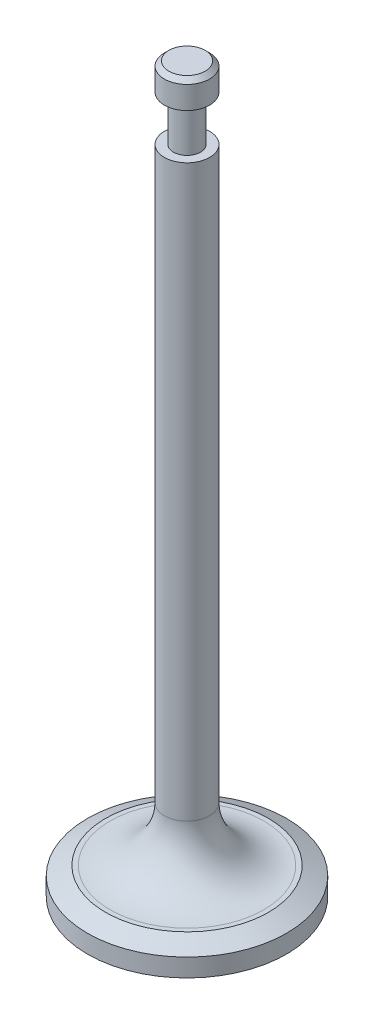
ISO-10303-21;
HEADER;
FILE_DESCRIPTION(('STEP AP214'),'2;1');
FILE_NAME('part.step','',(''),(''),'','','');
FILE_SCHEMA(('AUTOMOTIVE_DESIGN { 1 0 10303 214 1 1 1 1 }'));
ENDSEC;
DATA;
#1=APPLICATION_CONTEXT('core data for automotive mechanical design processes');
#2=APPLICATION_PROTOCOL_DEFINITION('international standard','automotive_design',2000,#1);
#3=PRODUCT_CONTEXT('',#1,'mechanical');
#4=PRODUCT('Part','Part','',(#3));
#5=PRODUCT_RELATED_PRODUCT_CATEGORY('part','',(#4));
#6=PRODUCT_DEFINITION_FORMATION('','',#4);
#7=PRODUCT_DEFINITION_CONTEXT('part definition',#1,'design');
#8=PRODUCT_DEFINITION('design','',#6,#7);
#9=PRODUCT_DEFINITION_SHAPE('','',#8);
#10=(LENGTH_UNIT() NAMED_UNIT(*) SI_UNIT(.MILLI.,.METRE.));
#11=(NAMED_UNIT(*) PLANE_ANGLE_UNIT() SI_UNIT($,.RADIAN.));
#12=(NAMED_UNIT(*) SI_UNIT($,.STERADIAN.) SOLID_ANGLE_UNIT());
#13=UNCERTAINTY_MEASURE_WITH_UNIT(LENGTH_MEASURE(1.E-05),#10,'distance_accuracy_value','');
#14=(GEOMETRIC_REPRESENTATION_CONTEXT(3) GLOBAL_UNCERTAINTY_ASSIGNED_CONTEXT((#13)) GLOBAL_UNIT_ASSIGNED_CONTEXT((#10,
#11,#12)) REPRESENTATION_CONTEXT('',''));
#15=CARTESIAN_POINT('',(0.,0.,0.));
#16=DIRECTION('',(0.,0.,1.));
#17=DIRECTION('',(1.,0.,0.));
#18=AXIS2_PLACEMENT_3D('',#15,#16,#17);
#19=CARTESIAN_POINT('',(0.,0.,-10.));
#20=DIRECTION('',(0.,-1.,0.));
#21=DIRECTION('',(0.,0.,-1.));
#22=AXIS2_PLACEMENT_3D('',#19,#20,#21);
#23=PLANE('',#22);
#24=CARTESIAN_POINT('',(0.,0.,0.));
#25=DIRECTION('',(0.,-1.,0.));
#26=DIRECTION('',(0.,0.,-1.));
#27=AXIS2_PLACEMENT_3D('',#24,#25,#26);
#28=CIRCLE('',#27,8.00000000000003);
#29=CARTESIAN_POINT('',(0.,0.,-8.00000000000003));
#30=VERTEX_POINT('',#29);
#31=EDGE_CURVE('E45',#30,#30,#28,.F.);
#32=ORIENTED_EDGE('',*,*,#31,.T.);
#33=EDGE_LOOP('',(#32));
#34=FACE_BOUND('',#33,.T.);
#35=ADVANCED_FACE('F37',(#34),#23,.F.);
#36=CARTESIAN_POINT('',(0.,-320.,0.));
#37=DIRECTION('',(0.,1.,0.));
#38=DIRECTION('',(0.,0.,1.));
#39=AXIS2_PLACEMENT_3D('',#36,#37,#38);
#40=PLANE('',#39);
#41=CARTESIAN_POINT('',(0.,-320.,0.));
#42=DIRECTION('',(0.,1.,0.));
#43=DIRECTION('',(0.,0.,1.));
#44=AXIS2_PLACEMENT_3D('',#41,#42,#43);
#45=CIRCLE('',#44,44.);
#46=CARTESIAN_POINT('',(0.,-320.,44.));
#47=VERTEX_POINT('',#46);
#48=EDGE_CURVE('E64',#47,#47,#45,.T.);
#49=ORIENTED_EDGE('',*,*,#48,.F.);
#50=EDGE_LOOP('',(#49));
#51=FACE_BOUND('',#50,.T.);
#52=ADVANCED_FACE('F112',(#51),#40,.F.);
#53=CARTESIAN_POINT('',(0.,0.,0.));
#54=DIRECTION('',(0.,1.,0.));
#55=DIRECTION('',(0.,0.,1.));
#56=AXIS2_PLACEMENT_3D('',#53,#54,#55);
#57=CYLINDRICAL_SURFACE('',#56,44.);
#58=CARTESIAN_POINT('',(0.,-312.,0.));
#59=DIRECTION('',(0.,-1.,0.));
#60=DIRECTION('',(0.,0.,-1.));
#61=AXIS2_PLACEMENT_3D('',#58,#59,#60);
#62=CIRCLE('',#61,44.);
#63=CARTESIAN_POINT('',(0.,-312.,-44.));
#64=VERTEX_POINT('',#63);
#65=EDGE_CURVE('E49',#64,#64,#62,.T.);
#66=ORIENTED_EDGE('',*,*,#65,.T.);
#67=EDGE_LOOP('',(#66));
#68=FACE_BOUND('',#67,.T.);
#69=ORIENTED_EDGE('',*,*,#48,.T.);
#70=EDGE_LOOP('',(#69));
#71=FACE_BOUND('',#70,.T.);
#72=ADVANCED_FACE('F108',(#68,#71),#57,.T.);
#73=CARTESIAN_POINT('',(0.,-308.,-44.));
#74=DIRECTION('',(0.,-1.,0.));
#75=DIRECTION('',(0.,0.,-1.));
#76=AXIS2_PLACEMENT_3D('',#73,#74,#75);
#77=PLANE('',#76);
#78=CARTESIAN_POINT('',(0.,-308.,0.));
#79=DIRECTION('',(0.,-1.,0.));
#80=DIRECTION('',(0.,0.,-1.));
#81=AXIS2_PLACEMENT_3D('',#78,#79,#80);
#82=CIRCLE('',#81,35.9999999999997);
#83=CARTESIAN_POINT('',(0.,-308.,-35.9999999999997));
#84=VERTEX_POINT('',#83);
#85=EDGE_CURVE('E53',#84,#84,#82,.F.);
#86=ORIENTED_EDGE('',*,*,#85,.T.);
#87=EDGE_LOOP('',(#86));
#88=FACE_BOUND('',#87,.T.);
#89=CARTESIAN_POINT('',(0.,-308.,0.));
#90=DIRECTION('',(0.,-1.,0.));
#91=DIRECTION('',(0.,0.,-1.));
#92=AXIS2_PLACEMENT_3D('',#89,#90,#91);
#93=CIRCLE('',#92,34.);
#94=CARTESIAN_POINT('',(0.,-308.,-34.));
#95=VERTEX_POINT('',#94);
#96=EDGE_CURVE('E58',#95,#95,#93,.T.);
#97=ORIENTED_EDGE('',*,*,#96,.T.);
#98=EDGE_LOOP('',(#97));
#99=FACE_BOUND('',#98,.T.);
#100=ADVANCED_FACE('F102',(#88,#99),#77,.F.);
#101=CARTESIAN_POINT('',(0.,0.,0.));
#102=DIRECTION('',(0.,1.,0.));
#103=DIRECTION('',(0.,0.,1.));
#104=AXIS2_PLACEMENT_3D('',#101,#102,#103);
#105=CYLINDRICAL_SURFACE('',#104,10.);
#106=CARTESIAN_POINT('',(0.,-284.,0.));
#107=DIRECTION('',(0.,-1.,0.));
#108=DIRECTION('',(0.,0.,-1.));
#109=AXIS2_PLACEMENT_3D('',#106,#107,#108);
#110=CIRCLE('',#109,10.);
#111=CARTESIAN_POINT('',(0.,-284.,-10.));
#112=VERTEX_POINT('',#111);
#113=EDGE_CURVE('E61',#112,#112,#110,.F.);
#114=ORIENTED_EDGE('',*,*,#113,.T.);
#115=EDGE_LOOP('',(#114));
#116=FACE_BOUND('',#115,.T.);
#117=CARTESIAN_POINT('',(0.,-32.,0.));
#118=DIRECTION('',(0.,1.,0.));
#119=DIRECTION('',(0.,0.,1.));
#120=AXIS2_PLACEMENT_3D('',#117,#118,#119);
#121=CIRCLE('',#120,10.);
#122=CARTESIAN_POINT('',(0.,-32.,10.));
#123=VERTEX_POINT('',#122);
#124=EDGE_CURVE('E67',#123,#123,#121,.T.);
#125=ORIENTED_EDGE('',*,*,#124,.F.);
#126=EDGE_LOOP('',(#125));
#127=FACE_BOUND('',#126,.T.);
#128=ADVANCED_FACE('F97',(#116,#127),#105,.T.);
#129=CARTESIAN_POINT('',(0.,-32.,-10.));
#130=DIRECTION('',(0.,-1.,0.));
#131=DIRECTION('',(0.,0.,-1.));
#132=AXIS2_PLACEMENT_3D('',#129,#130,#131);
#133=PLANE('',#132);
#134=CARTESIAN_POINT('',(0.,-32.,0.));
#135=DIRECTION('',(0.,1.,0.));
#136=DIRECTION('',(0.,0.,1.));
#137=AXIS2_PLACEMENT_3D('',#134,#135,#136);
#138=CIRCLE('',#137,6.00000000000003);
#139=CARTESIAN_POINT('',(0.,-32.,6.00000000000003));
#140=VERTEX_POINT('',#139);
#141=EDGE_CURVE('E70',#140,#140,#138,.T.);
#142=ORIENTED_EDGE('',*,*,#141,.F.);
#143=EDGE_LOOP('',(#142));
#144=FACE_BOUND('',#143,.T.);
#145=ORIENTED_EDGE('',*,*,#124,.T.);
#146=EDGE_LOOP('',(#145));
#147=FACE_BOUND('',#146,.T.);
#148=ADVANCED_FACE('F91',(#144,#147),#133,.F.);
#149=CARTESIAN_POINT('',(0.,0.,0.));
#150=DIRECTION('',(0.,1.,0.));
#151=DIRECTION('',(0.,0.,1.));
#152=AXIS2_PLACEMENT_3D('',#149,#150,#151);
#153=CYLINDRICAL_SURFACE('',#152,6.00000000000003);
#154=CARTESIAN_POINT('',(0.,-12.,0.));
#155=DIRECTION('',(0.,1.,0.));
#156=DIRECTION('',(0.,0.,1.));
#157=AXIS2_PLACEMENT_3D('',#154,#155,#156);
#158=CIRCLE('',#157,6.00000000000004);
#159=CARTESIAN_POINT('',(0.,-12.,6.00000000000003));
#160=VERTEX_POINT('',#159);
#161=EDGE_CURVE('E73',#160,#160,#158,.T.);
#162=ORIENTED_EDGE('',*,*,#161,.F.);
#163=EDGE_LOOP('',(#162));
#164=FACE_BOUND('',#163,.T.);
#165=ORIENTED_EDGE('',*,*,#141,.T.);
#166=EDGE_LOOP('',(#165));
#167=FACE_BOUND('',#166,.T.);
#168=ADVANCED_FACE('F85',(#164,#167),#153,.T.);
#169=CARTESIAN_POINT('',(0.,-12.,-6.00000000000004));
#170=DIRECTION('',(0.,1.,0.));
#171=DIRECTION('',(0.,0.,1.));
#172=AXIS2_PLACEMENT_3D('',#169,#170,#171);
#173=PLANE('',#172);
#174=CARTESIAN_POINT('',(0.,-12.,0.));
#175=DIRECTION('',(0.,1.,0.));
#176=DIRECTION('',(0.,0.,1.));
#177=AXIS2_PLACEMENT_3D('',#174,#175,#176);
#178=CIRCLE('',#177,10.);
#179=CARTESIAN_POINT('',(0.,-12.,10.));
#180=VERTEX_POINT('',#179);
#181=EDGE_CURVE('E76',#180,#180,#178,.T.);
#182=ORIENTED_EDGE('',*,*,#181,.F.);
#183=EDGE_LOOP('',(#182));
#184=FACE_BOUND('',#183,.T.);
#185=ORIENTED_EDGE('',*,*,#161,.T.);
#186=EDGE_LOOP('',(#185));
#187=FACE_BOUND('',#186,.T.);
#188=ADVANCED_FACE('F82',(#184,#187),#173,.F.);
#189=CARTESIAN_POINT('',(0.,0.,0.));
#190=DIRECTION('',(0.,1.,0.));
#191=DIRECTION('',(0.,0.,1.));
#192=AXIS2_PLACEMENT_3D('',#189,#190,#191);
#193=CYLINDRICAL_SURFACE('',#192,10.);
#194=CARTESIAN_POINT('',(0.,-2.00000000000001,0.));
#195=DIRECTION('',(0.,-1.,0.));
#196=DIRECTION('',(0.,0.,-1.));
#197=AXIS2_PLACEMENT_3D('',#194,#195,#196);
#198=CIRCLE('',#197,10.);
#199=CARTESIAN_POINT('',(0.,-2.00000000000001,-10.));
#200=VERTEX_POINT('',#199);
#201=EDGE_CURVE('E10',#200,#200,#198,.T.);
#202=ORIENTED_EDGE('',*,*,#201,.T.);
#203=EDGE_LOOP('',(#202));
#204=FACE_BOUND('',#203,.T.);
#205=ORIENTED_EDGE('',*,*,#181,.T.);
#206=EDGE_LOOP('',(#205));
#207=FACE_BOUND('',#206,.T.);
#208=ADVANCED_FACE('F80',(#204,#207),#193,.T.);
#209=CARTESIAN_POINT('',(0.,-284.,0.));
#210=DIRECTION('',(0.,-1.,0.));
#211=DIRECTION('',(0.,0.,-1.));
#212=AXIS2_PLACEMENT_3D('',#209,#210,#211);
#213=TOROIDAL_SURFACE('',#212,34.,24.);
#214=ORIENTED_EDGE('',*,*,#96,.F.);
#215=EDGE_LOOP('',(#214));
#216=FACE_BOUND('',#215,.T.);
#217=ORIENTED_EDGE('',*,*,#113,.F.);
#218=EDGE_LOOP('',(#217));
#219=FACE_BOUND('',#218,.T.);
#220=ADVANCED_FACE('F121',(#216,#219),#213,.F.);
#221=CARTESIAN_POINT('',(0.,-308.,0.));
#222=DIRECTION('',(0.,-1.,0.));
#223=DIRECTION('',(0.,0.,-1.));
#224=AXIS2_PLACEMENT_3D('',#221,#222,#223);
#225=CONICAL_SURFACE('',#224,35.9999999999997,1.10714871779409);
#226=ORIENTED_EDGE('',*,*,#65,.F.);
#227=EDGE_LOOP('',(#226));
#228=FACE_BOUND('',#227,.T.);
#229=ORIENTED_EDGE('',*,*,#85,.F.);
#230=EDGE_LOOP('',(#229));
#231=FACE_BOUND('',#230,.T.);
#232=ADVANCED_FACE('F123',(#228,#231),#225,.T.);
#233=CARTESIAN_POINT('',(0.,0.,0.));
#234=DIRECTION('',(0.,-1.,0.));
#235=DIRECTION('',(0.,0.,-1.));
#236=AXIS2_PLACEMENT_3D('',#233,#234,#235);
#237=CONICAL_SURFACE('',#236,8.00000000000003,0.785398163397446);
#238=ORIENTED_EDGE('',*,*,#201,.F.);
#239=EDGE_LOOP('',(#238));
#240=FACE_BOUND('',#239,.T.);
#241=ORIENTED_EDGE('',*,*,#31,.F.);
#242=EDGE_LOOP('',(#241));
#243=FACE_BOUND('',#242,.T.);
#244=ADVANCED_FACE('F40',(#240,#243),#237,.T.);
#245=CLOSED_SHELL('',(#35,#52,#72,#100,#128,#148,#168,#188,#208,#220,#232,#244));
#246=MANIFOLD_SOLID_BREP('B2',#245);
#247=ADVANCED_BREP_SHAPE_REPRESENTATION('',(#18,#246),#14);
#248=SHAPE_DEFINITION_REPRESENTATION(#9,#247);
ENDSEC;
END-ISO-10303-21;
